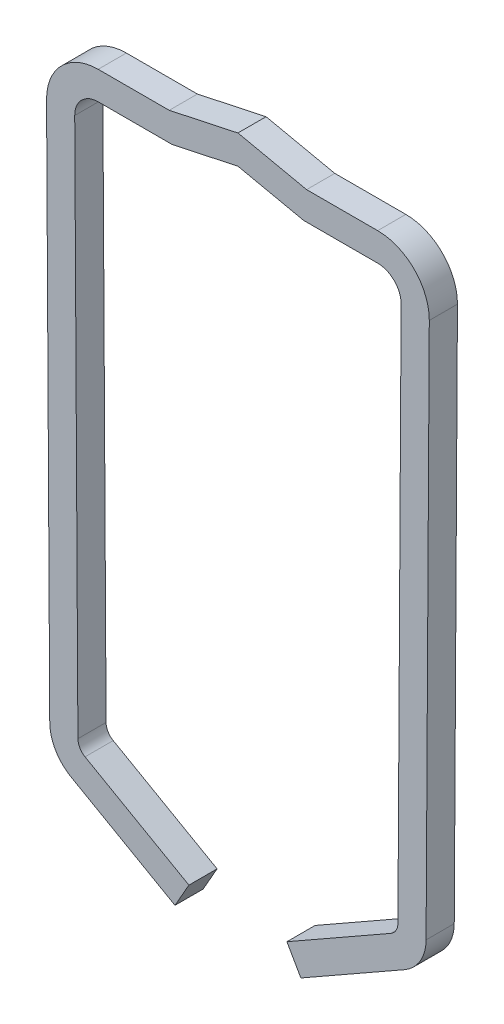
ISO-10303-21;
HEADER;
FILE_DESCRIPTION(('STEP AP214'),'2;1');
FILE_NAME('part.step','',(''),(''),'','','');
FILE_SCHEMA(('AUTOMOTIVE_DESIGN { 1 0 10303 214 1 1 1 1 }'));
ENDSEC;
DATA;
#1=APPLICATION_CONTEXT('core data for automotive mechanical design processes');
#2=APPLICATION_PROTOCOL_DEFINITION('international standard','automotive_design',2000,#1);
#3=PRODUCT_CONTEXT('',#1,'mechanical');
#4=PRODUCT('Part','Part','',(#3));
#5=PRODUCT_RELATED_PRODUCT_CATEGORY('part','',(#4));
#6=PRODUCT_DEFINITION_FORMATION('','',#4);
#7=PRODUCT_DEFINITION_CONTEXT('part definition',#1,'design');
#8=PRODUCT_DEFINITION('design','',#6,#7);
#9=PRODUCT_DEFINITION_SHAPE('','',#8);
#10=(LENGTH_UNIT() NAMED_UNIT(*) SI_UNIT(.MILLI.,.METRE.));
#11=(NAMED_UNIT(*) PLANE_ANGLE_UNIT() SI_UNIT($,.RADIAN.));
#12=(NAMED_UNIT(*) SI_UNIT($,.STERADIAN.) SOLID_ANGLE_UNIT());
#13=UNCERTAINTY_MEASURE_WITH_UNIT(LENGTH_MEASURE(1.E-05),#10,'distance_accuracy_value','');
#14=(GEOMETRIC_REPRESENTATION_CONTEXT(3) GLOBAL_UNCERTAINTY_ASSIGNED_CONTEXT((#13)) GLOBAL_UNIT_ASSIGNED_CONTEXT((#10,
#11,#12)) REPRESENTATION_CONTEXT('',''));
#15=CARTESIAN_POINT('',(0.,0.,0.));
#16=DIRECTION('',(0.,0.,1.));
#17=DIRECTION('',(1.,0.,0.));
#18=AXIS2_PLACEMENT_3D('',#15,#16,#17);
#19=CARTESIAN_POINT('',(-15.580990054256,9.75233172291069,29.2718890659961));
#20=DIRECTION('',(0.,0.,-1.));
#21=DIRECTION('',(0.,1.,0.));
#22=AXIS2_PLACEMENT_3D('',#19,#20,#21);
#23=CYLINDRICAL_SURFACE('',#22,0.75);
#24=DIRECTION('',(0.,0.,1.));
#25=VECTOR('',#24,1.);
#26=CARTESIAN_POINT('',(-14.831003372568,9.74786212670069,29.5218890659961));
#27=LINE('',#26,#25);
#28=CARTESIAN_POINT('',(-14.831003372568,9.74786212670384,29.5218890659961));
#29=VERTEX_POINT('',#28);
#30=CARTESIAN_POINT('',(-14.831003372568,9.74786212670386,31.0218890659961));
#31=VERTEX_POINT('',#30);
#32=EDGE_CURVE('E242',#29,#31,#27,.T.);
#33=ORIENTED_EDGE('',*,*,#32,.F.);
#34=CARTESIAN_POINT('',(-15.580990054256,9.75233172291069,29.5218890659961));
#35=DIRECTION('',(0.,0.,-1.));
#36=DIRECTION('',(0.,1.,0.));
#37=AXIS2_PLACEMENT_3D('',#34,#35,#36);
#38=CIRCLE('',#37,0.75);
#39=CARTESIAN_POINT('',(-15.2098674972687,9.10058940596284,29.5218890659961));
#40=VERTEX_POINT('',#39);
#41=EDGE_CURVE('E19',#40,#29,#38,.F.);
#42=ORIENTED_EDGE('',*,*,#41,.F.);
#43=DIRECTION('',(0.,0.,1.));
#44=VECTOR('',#43,1.);
#45=CARTESIAN_POINT('',(-15.2098674972707,9.10058940596364,29.5218890659961));
#46=LINE('',#45,#44);
#47=CARTESIAN_POINT('',(-15.2098674972693,9.1005894059644,31.0218890659961));
#48=VERTEX_POINT('',#47);
#49=EDGE_CURVE('E246',#48,#40,#46,.F.);
#50=ORIENTED_EDGE('',*,*,#49,.F.);
#51=CARTESIAN_POINT('',(-15.580990054256,9.75233172291069,31.0218890659961));
#52=DIRECTION('',(0.,0.,-1.));
#53=DIRECTION('',(0.,1.,0.));
#54=AXIS2_PLACEMENT_3D('',#51,#52,#53);
#55=CIRCLE('',#54,0.75);
#56=EDGE_CURVE('E398',#31,#48,#55,.T.);
#57=ORIENTED_EDGE('',*,*,#56,.F.);
#58=EDGE_LOOP('',(#33,#42,#50,#57));
#59=FACE_BOUND('',#58,.T.);
#60=ADVANCED_FACE('F16',(#59),#23,.F.);
#61=CARTESIAN_POINT('',(-31.124438416604,9.75233172291069,29.2718890659961));
#62=DIRECTION('',(0.,0.,-1.));
#63=DIRECTION('',(0.,1.,0.));
#64=AXIS2_PLACEMENT_3D('',#61,#62,#63);
#65=CYLINDRICAL_SURFACE('',#64,0.75);
#66=DIRECTION('',(0.,0.,1.));
#67=VECTOR('',#66,1.);
#68=CARTESIAN_POINT('',(-31.495560973591,9.1005894059607,29.5218890659961));
#69=LINE('',#68,#67);
#70=CARTESIAN_POINT('',(-31.4955609735922,9.10058940596137,29.5218890659961));
#71=VERTEX_POINT('',#70);
#72=CARTESIAN_POINT('',(-31.4955609735924,9.10058940596146,31.0218890659961));
#73=VERTEX_POINT('',#72);
#74=EDGE_CURVE('E326',#71,#73,#69,.T.);
#75=ORIENTED_EDGE('',*,*,#74,.F.);
#76=CARTESIAN_POINT('',(-31.124438416604,9.75233172291069,29.5218890659961));
#77=DIRECTION('',(0.,0.,-1.));
#78=DIRECTION('',(0.,1.,0.));
#79=AXIS2_PLACEMENT_3D('',#76,#77,#78);
#80=CIRCLE('',#79,0.75);
#81=CARTESIAN_POINT('',(-31.8744250982924,9.74786212670384,29.5218890659961));
#82=VERTEX_POINT('',#81);
#83=EDGE_CURVE('E399',#82,#71,#80,.F.);
#84=ORIENTED_EDGE('',*,*,#83,.F.);
#85=DIRECTION('',(0.,0.,1.));
#86=VECTOR('',#85,1.);
#87=CARTESIAN_POINT('',(-31.8744250982928,9.74786212670068,29.5218890659961));
#88=LINE('',#87,#86);
#89=CARTESIAN_POINT('',(-31.8744250982929,9.74786212670385,31.0218890659961));
#90=VERTEX_POINT('',#89);
#91=EDGE_CURVE('E333',#90,#82,#88,.F.);
#92=ORIENTED_EDGE('',*,*,#91,.F.);
#93=CARTESIAN_POINT('',(-31.124438416604,9.75233172291069,31.0218890659961));
#94=DIRECTION('',(0.,0.,-1.));
#95=DIRECTION('',(0.,1.,0.));
#96=AXIS2_PLACEMENT_3D('',#93,#94,#95);
#97=CIRCLE('',#96,0.75);
#98=EDGE_CURVE('E306',#73,#90,#97,.T.);
#99=ORIENTED_EDGE('',*,*,#98,.F.);
#100=EDGE_LOOP('',(#75,#84,#92,#99));
#101=FACE_BOUND('',#100,.T.);
#102=ADVANCED_FACE('F744',(#101),#65,.F.);
#103=CARTESIAN_POINT('',(-20.74271423543,5.95001259746069,31.0218890659961));
#104=DIRECTION('',(0.,0.,1.));
#105=DIRECTION('',(0.,-1.,0.));
#106=AXIS2_PLACEMENT_3D('',#103,#104,#105);
#107=PLANE('',#106);
#108=CARTESIAN_POINT('',(-30.795242578558,38.4143181664607,31.0218890659961));
#109=DIRECTION('',(0.,0.,-1.));
#110=DIRECTION('',(0.,1.,0.));
#111=AXIS2_PLACEMENT_3D('',#108,#109,#110);
#112=CIRCLE('',#111,1.25);
#113=CARTESIAN_POINT('',(-32.045220381372,38.4068688394526,31.0218890659961));
#114=VERTEX_POINT('',#113);
#115=CARTESIAN_POINT('',(-30.795242578558,39.6643181664607,31.0218890659961));
#116=VERTEX_POINT('',#115);
#117=EDGE_CURVE('E334',#114,#116,#112,.T.);
#118=ORIENTED_EDGE('',*,*,#117,.T.);
#119=DIRECTION('',(1.,0.,0.));
#120=VECTOR('',#119,1.);
#121=CARTESIAN_POINT('',(-26.85271423543,39.6643181664607,31.0218890659961));
#122=LINE('',#121,#120);
#123=CARTESIAN_POINT('',(-26.85271423543,39.6643181664607,31.0218890659961));
#124=VERTEX_POINT('',#123);
#125=EDGE_CURVE('E335',#124,#116,#122,.F.);
#126=ORIENTED_EDGE('',*,*,#125,.F.);
#127=DIRECTION('',(0.977802414077404,0.209529088730901,0.));
#128=VECTOR('',#127,1.);
#129=CARTESIAN_POINT('',(-23.35271423543,40.4143181664607,31.0218890659961));
#130=LINE('',#129,#128);
#131=CARTESIAN_POINT('',(-23.35271423543,40.4143181664607,31.0218890659961));
#132=VERTEX_POINT('',#131);
#133=EDGE_CURVE('E204',#132,#124,#130,.F.);
#134=ORIENTED_EDGE('',*,*,#133,.F.);
#135=DIRECTION('',(0.977802414077404,-0.209529088730901,0.));
#136=VECTOR('',#135,1.);
#137=CARTESIAN_POINT('',(-19.85271423543,39.6643181664607,31.0218890659961));
#138=LINE('',#137,#136);
#139=CARTESIAN_POINT('',(-19.85271423543,39.6643181664607,31.0218890659961));
#140=VERTEX_POINT('',#139);
#141=EDGE_CURVE('E206',#140,#132,#138,.F.);
#142=ORIENTED_EDGE('',*,*,#141,.F.);
#143=DIRECTION('',(1.,0.,0.));
#144=VECTOR('',#143,1.);
#145=CARTESIAN_POINT('',(-15.910185892302,39.6643181664607,31.0218890659961));
#146=LINE('',#145,#144);
#147=CARTESIAN_POINT('',(-15.910185892302,39.6643181664607,31.0218890659961));
#148=VERTEX_POINT('',#147);
#149=EDGE_CURVE('E211',#148,#140,#146,.F.);
#150=ORIENTED_EDGE('',*,*,#149,.F.);
#151=CARTESIAN_POINT('',(-15.910185892302,38.4143181664607,31.0218890659961));
#152=DIRECTION('',(0.,0.,-1.));
#153=DIRECTION('',(0.,1.,0.));
#154=AXIS2_PLACEMENT_3D('',#151,#152,#153);
#155=CIRCLE('',#154,1.25);
#156=CARTESIAN_POINT('',(-14.6602080894885,38.4068688394526,31.0218890659961));
#157=VERTEX_POINT('',#156);
#158=EDGE_CURVE('E224',#148,#157,#155,.T.);
#159=ORIENTED_EDGE('',*,*,#158,.T.);
#160=DIRECTION('',(-0.00595946160490619,-0.999982242251021,0.));
#161=VECTOR('',#160,1.);
#162=CARTESIAN_POINT('',(-14.831003372568,9.74786212670069,31.0218890659961));
#163=LINE('',#162,#161);
#164=EDGE_CURVE('E245',#31,#157,#163,.F.);
#165=ORIENTED_EDGE('',*,*,#164,.F.);
#166=ORIENTED_EDGE('',*,*,#56,.T.);
#167=DIRECTION('',(-0.868989755925164,-0.49483007598278,0.));
#168=VECTOR('',#167,1.);
#169=CARTESIAN_POINT('',(-20.74271423543,5.95001259746069,31.0218890659961));
#170=LINE('',#169,#168);
#171=CARTESIAN_POINT('',(-20.74271423543,5.95001259746069,31.0218890659961));
#172=VERTEX_POINT('',#171);
#173=EDGE_CURVE('E248',#172,#48,#170,.F.);
#174=ORIENTED_EDGE('',*,*,#173,.F.);
#175=DIRECTION('',(-0.49483007598278,0.868989755925164,0.));
#176=VECTOR('',#175,1.);
#177=CARTESIAN_POINT('',(-20.74271423543,5.95001259746069,31.0218890659961));
#178=LINE('',#177,#176);
#179=CARTESIAN_POINT('',(-20.0004691214549,4.64652796357132,31.0218890659961));
#180=VERTEX_POINT('',#179);
#181=EDGE_CURVE('E261',#172,#180,#178,.F.);
#182=ORIENTED_EDGE('',*,*,#181,.T.);
#183=DIRECTION('',(0.868989755925164,0.49483007598278,0.));
#184=VECTOR('',#183,1.);
#185=CARTESIAN_POINT('',(-20.000469121456,4.64652796357069,31.0218890659961));
#186=LINE('',#185,#184);
#187=CARTESIAN_POINT('',(-14.4676223832948,7.79710477207472,31.0218890659961));
#188=VERTEX_POINT('',#187);
#189=EDGE_CURVE('E267',#188,#180,#186,.F.);
#190=ORIENTED_EDGE('',*,*,#189,.F.);
#191=CARTESIAN_POINT('',(-15.580990054256,9.75233172291069,31.0218890659961));
#192=DIRECTION('',(0.,0.,-1.));
#193=DIRECTION('',(0.,1.,0.));
#194=AXIS2_PLACEMENT_3D('',#191,#192,#193);
#195=CIRCLE('',#194,2.25);
#196=CARTESIAN_POINT('',(-13.3310300091906,9.73892293430017,31.0218890659961));
#197=VERTEX_POINT('',#196);
#198=EDGE_CURVE('E268',#197,#188,#195,.T.);
#199=ORIENTED_EDGE('',*,*,#198,.F.);
#200=DIRECTION('',(0.00595946160490619,0.999982242251021,0.));
#201=VECTOR('',#200,1.);
#202=CARTESIAN_POINT('',(-13.33103000919,9.73892293430069,31.0218890659961));
#203=LINE('',#202,#201);
#204=CARTESIAN_POINT('',(-13.1602347261109,38.397929647049,31.0218890659961));
#205=VERTEX_POINT('',#204);
#206=EDGE_CURVE('E272',#205,#197,#203,.F.);
#207=ORIENTED_EDGE('',*,*,#206,.F.);
#208=CARTESIAN_POINT('',(-15.910185892302,38.4143181664607,31.0218890659961));
#209=DIRECTION('',(0.,0.,-1.));
#210=DIRECTION('',(0.,1.,0.));
#211=AXIS2_PLACEMENT_3D('',#208,#209,#210);
#212=CIRCLE('',#211,2.75);
#213=CARTESIAN_POINT('',(-15.910185892302,41.1643181664607,31.0218890659961));
#214=VERTEX_POINT('',#213);
#215=EDGE_CURVE('E276',#214,#205,#212,.T.);
#216=ORIENTED_EDGE('',*,*,#215,.F.);
#217=DIRECTION('',(1.,0.,0.));
#218=VECTOR('',#217,1.);
#219=CARTESIAN_POINT('',(-15.910185892302,41.1643181664607,31.0218890659961));
#220=LINE('',#219,#218);
#221=CARTESIAN_POINT('',(-19.6938037037917,41.1643181664619,31.0218890659961));
#222=VERTEX_POINT('',#221);
#223=EDGE_CURVE('E280',#222,#214,#220,.T.);
#224=ORIENTED_EDGE('',*,*,#223,.F.);
#225=DIRECTION('',(-0.977802414077404,0.209529088730901,0.));
#226=VECTOR('',#225,1.);
#227=CARTESIAN_POINT('',(-19.538420602334,41.1310217875807,31.0218890659961));
#228=LINE('',#227,#226);
#229=CARTESIAN_POINT('',(-23.3527142354298,41.9483704232441,31.0218890659961));
#230=VERTEX_POINT('',#229);
#231=EDGE_CURVE('E284',#230,#222,#228,.F.);
#232=ORIENTED_EDGE('',*,*,#231,.F.);
#233=DIRECTION('',(-0.977802414077404,-0.209529088730901,0.));
#234=VECTOR('',#233,1.);
#235=CARTESIAN_POINT('',(-23.6670078685263,41.8810217875807,31.0218890659961));
#236=LINE('',#235,#234);
#237=CARTESIAN_POINT('',(-27.0116247670683,41.1643181664619,31.0218890659961));
#238=VERTEX_POINT('',#237);
#239=EDGE_CURVE('E175',#238,#230,#236,.F.);
#240=ORIENTED_EDGE('',*,*,#239,.F.);
#241=DIRECTION('',(1.,0.,0.));
#242=VECTOR('',#241,1.);
#243=CARTESIAN_POINT('',(-26.85271423543,41.1643181664607,31.0218890659961));
#244=LINE('',#243,#242);
#245=CARTESIAN_POINT('',(-30.795242578558,41.1643181664607,31.0218890659961));
#246=VERTEX_POINT('',#245);
#247=EDGE_CURVE('E298',#246,#238,#244,.T.);
#248=ORIENTED_EDGE('',*,*,#247,.F.);
#249=CARTESIAN_POINT('',(-30.795242578558,38.4143181664607,31.0218890659961));
#250=DIRECTION('',(0.,0.,-1.));
#251=DIRECTION('',(0.,1.,0.));
#252=AXIS2_PLACEMENT_3D('',#249,#250,#251);
#253=CIRCLE('',#252,2.75);
#254=CARTESIAN_POINT('',(-33.5451937447491,38.397929647049,31.0218890659961));
#255=VERTEX_POINT('',#254);
#256=EDGE_CURVE('E302',#255,#246,#253,.T.);
#257=ORIENTED_EDGE('',*,*,#256,.F.);
#258=DIRECTION('',(0.00595946160490607,-0.999982242251021,0.));
#259=VECTOR('',#258,1.);
#260=CARTESIAN_POINT('',(-33.54519374475,38.3979296470507,31.0218890659961));
#261=LINE('',#260,#259);
#262=CARTESIAN_POINT('',(-33.3743984616709,9.73892293430017,31.0218890659961));
#263=VERTEX_POINT('',#262);
#264=EDGE_CURVE('E309',#263,#255,#261,.F.);
#265=ORIENTED_EDGE('',*,*,#264,.F.);
#266=CARTESIAN_POINT('',(-31.124438416604,9.75233172291069,31.0218890659961));
#267=DIRECTION('',(0.,0.,-1.));
#268=DIRECTION('',(0.,1.,0.));
#269=AXIS2_PLACEMENT_3D('',#266,#267,#268);
#270=CIRCLE('',#269,2.25);
#271=CARTESIAN_POINT('',(-32.2378060875651,7.79710477207488,31.0218890659961));
#272=VERTEX_POINT('',#271);
#273=EDGE_CURVE('E391',#272,#263,#270,.T.);
#274=ORIENTED_EDGE('',*,*,#273,.F.);
#275=DIRECTION('',(0.868989755925164,-0.49483007598278,0.));
#276=VECTOR('',#275,1.);
#277=CARTESIAN_POINT('',(-32.237806087565,7.79710477207069,31.0218890659961));
#278=LINE('',#277,#276);
#279=CARTESIAN_POINT('',(-26.7049593494055,4.64652796356894,31.0218890659961));
#280=VERTEX_POINT('',#279);
#281=EDGE_CURVE('E313',#280,#272,#278,.F.);
#282=ORIENTED_EDGE('',*,*,#281,.F.);
#283=DIRECTION('',(0.49483007598278,0.868989755925164,0.));
#284=VECTOR('',#283,1.);
#285=CARTESIAN_POINT('',(-25.96271423543,5.95001259746069,31.0218890659961));
#286=LINE('',#285,#284);
#287=CARTESIAN_POINT('',(-25.9627142354306,5.95001259745971,31.0218890659961));
#288=VERTEX_POINT('',#287);
#289=EDGE_CURVE('E319',#288,#280,#286,.F.);
#290=ORIENTED_EDGE('',*,*,#289,.F.);
#291=DIRECTION('',(-0.868989755925164,0.49483007598278,0.));
#292=VECTOR('',#291,1.);
#293=CARTESIAN_POINT('',(-31.495560973591,9.1005894059607,31.0218890659961));
#294=LINE('',#293,#292);
#295=EDGE_CURVE('E324',#73,#288,#294,.F.);
#296=ORIENTED_EDGE('',*,*,#295,.F.);
#297=ORIENTED_EDGE('',*,*,#98,.T.);
#298=DIRECTION('',(-0.00595946160490607,0.999982242251021,0.));
#299=VECTOR('',#298,1.);
#300=CARTESIAN_POINT('',(-32.045220381372,38.4068688394507,31.0218890659961));
#301=LINE('',#300,#299);
#302=EDGE_CURVE('E330',#114,#90,#301,.F.);
#303=ORIENTED_EDGE('',*,*,#302,.F.);
#304=EDGE_LOOP('',(#118,#126,#134,#142,#150,#159,#165,#166,#174,#182,#190,#199,#207,#216,#224,
#232,#240,#248,#257,#265,#274,#282,#290,#296,#297,#303));
#305=FACE_BOUND('',#304,.T.);
#306=ADVANCED_FACE('F209',(#305),#107,.T.);
#307=CARTESIAN_POINT('',(-23.6670078685263,41.8810217875807,31.0218890659961));
#308=DIRECTION('',(-0.209529088730901,0.977802414077404,0.));
#309=DIRECTION('',(-0.977802414077404,-0.209529088730901,0.));
#310=AXIS2_PLACEMENT_3D('',#307,#308,#309);
#311=PLANE('',#310);
#312=ORIENTED_EDGE('',*,*,#239,.T.);
#313=DIRECTION('',(0.,0.,1.));
#314=VECTOR('',#313,1.);
#315=CARTESIAN_POINT('',(-23.3527142354293,41.9483704232441,31.0218890659961));
#316=LINE('',#315,#314);
#317=CARTESIAN_POINT('',(-23.3527142354298,41.9483704232418,29.5218890659961));
#318=VERTEX_POINT('',#317);
#319=EDGE_CURVE('E293',#318,#230,#316,.T.);
#320=ORIENTED_EDGE('',*,*,#319,.F.);
#321=DIRECTION('',(0.977802414077386,0.209529088730983,0.));
#322=VECTOR('',#321,1.);
#323=CARTESIAN_POINT('',(-27.011624767068,41.1643181664607,29.5218890659961));
#324=LINE('',#323,#322);
#325=CARTESIAN_POINT('',(-27.011624767068,41.1643181664607,29.5218890659961));
#326=VERTEX_POINT('',#325);
#327=EDGE_CURVE('E181',#326,#318,#324,.T.);
#328=ORIENTED_EDGE('',*,*,#327,.F.);
#329=DIRECTION('',(0.,0.,1.));
#330=VECTOR('',#329,1.);
#331=CARTESIAN_POINT('',(-27.011624767068,41.1643181664607,31.0218890659961));
#332=LINE('',#331,#330);
#333=EDGE_CURVE('E301',#238,#326,#332,.F.);
#334=ORIENTED_EDGE('',*,*,#333,.F.);
#335=EDGE_LOOP('',(#312,#320,#328,#334));
#336=FACE_BOUND('',#335,.T.);
#337=ADVANCED_FACE('F726',(#336),#311,.T.);
#338=CARTESIAN_POINT('',(-19.538420602334,41.1310217875807,31.0218890659961));
#339=DIRECTION('',(0.209529088730901,0.977802414077404,0.));
#340=DIRECTION('',(-0.977802414077404,0.209529088730901,0.));
#341=AXIS2_PLACEMENT_3D('',#338,#339,#340);
#342=PLANE('',#341);
#343=ORIENTED_EDGE('',*,*,#231,.T.);
#344=DIRECTION('',(0.,0.,1.));
#345=VECTOR('',#344,1.);
#346=CARTESIAN_POINT('',(-19.693803703792,41.1643181664607,31.0218890659961));
#347=LINE('',#346,#345);
#348=CARTESIAN_POINT('',(-19.693803703792,41.1643181664607,29.5218890659961));
#349=VERTEX_POINT('',#348);
#350=EDGE_CURVE('E281',#349,#222,#347,.T.);
#351=ORIENTED_EDGE('',*,*,#350,.F.);
#352=DIRECTION('',(0.977802414077386,-0.209529088730983,0.));
#353=VECTOR('',#352,1.);
#354=CARTESIAN_POINT('',(-23.35271423543,41.9483704232407,29.5218890659961));
#355=LINE('',#354,#353);
#356=EDGE_CURVE('E287',#318,#349,#355,.T.);
#357=ORIENTED_EDGE('',*,*,#356,.F.);
#358=ORIENTED_EDGE('',*,*,#319,.T.);
#359=EDGE_LOOP('',(#343,#351,#357,#358));
#360=FACE_BOUND('',#359,.T.);
#361=ADVANCED_FACE('F716',(#360),#342,.T.);
#362=CARTESIAN_POINT('',(-15.910185892302,41.1643181664607,31.0218890659961));
#363=DIRECTION('',(0.,1.,0.));
#364=DIRECTION('',(0.,0.,1.));
#365=AXIS2_PLACEMENT_3D('',#362,#363,#364);
#366=PLANE('',#365);
#367=ORIENTED_EDGE('',*,*,#223,.T.);
#368=DIRECTION('',(0.,0.,-1.));
#369=VECTOR('',#368,1.);
#370=CARTESIAN_POINT('',(-15.910185892302,41.1643181664607,29.2718890659961));
#371=LINE('',#370,#369);
#372=CARTESIAN_POINT('',(-15.910185892302,41.1643181664607,29.5218890659961));
#373=VERTEX_POINT('',#372);
#374=EDGE_CURVE('E277',#373,#214,#371,.F.);
#375=ORIENTED_EDGE('',*,*,#374,.F.);
#376=DIRECTION('',(1.,0.,0.));
#377=VECTOR('',#376,1.);
#378=CARTESIAN_POINT('',(-20.000469121456,41.1643181664607,29.5218890659961));
#379=LINE('',#378,#377);
#380=EDGE_CURVE('E290',#349,#373,#379,.T.);
#381=ORIENTED_EDGE('',*,*,#380,.F.);
#382=ORIENTED_EDGE('',*,*,#350,.T.);
#383=EDGE_LOOP('',(#367,#375,#381,#382));
#384=FACE_BOUND('',#383,.T.);
#385=ADVANCED_FACE('F706',(#384),#366,.T.);
#386=CARTESIAN_POINT('',(-15.910185892302,38.4143181664607,29.2718890659961));
#387=DIRECTION('',(0.,0.,-1.));
#388=DIRECTION('',(0.,1.,0.));
#389=AXIS2_PLACEMENT_3D('',#386,#387,#388);
#390=CYLINDRICAL_SURFACE('',#389,2.75);
#391=ORIENTED_EDGE('',*,*,#215,.T.);
#392=DIRECTION('',(0.,0.,1.));
#393=VECTOR('',#392,1.);
#394=CARTESIAN_POINT('',(-13.1602347261109,38.3979296470507,31.0218890659961));
#395=LINE('',#394,#393);
#396=CARTESIAN_POINT('',(-13.1602347261104,38.3979296470489,29.5218890659961));
#397=VERTEX_POINT('',#396);
#398=EDGE_CURVE('E273',#397,#205,#395,.T.);
#399=ORIENTED_EDGE('',*,*,#398,.F.);
#400=CARTESIAN_POINT('',(-15.910185892302,38.4143181664607,29.5218890659961));
#401=DIRECTION('',(0.,0.,-1.));
#402=DIRECTION('',(0.,1.,0.));
#403=AXIS2_PLACEMENT_3D('',#400,#401,#402);
#404=CIRCLE('',#403,2.75);
#405=EDGE_CURVE('E387',#373,#397,#404,.T.);
#406=ORIENTED_EDGE('',*,*,#405,.F.);
#407=ORIENTED_EDGE('',*,*,#374,.T.);
#408=EDGE_LOOP('',(#391,#399,#406,#407));
#409=FACE_BOUND('',#408,.T.);
#410=ADVANCED_FACE('F696',(#409),#390,.T.);
#411=CARTESIAN_POINT('',(-13.33103000919,9.73892293430069,31.0218890659961));
#412=DIRECTION('',(0.999982242251021,-0.00595946160490619,0.));
#413=DIRECTION('',(0.00595946160490619,0.999982242251021,0.));
#414=AXIS2_PLACEMENT_3D('',#411,#412,#413);
#415=PLANE('',#414);
#416=ORIENTED_EDGE('',*,*,#206,.T.);
#417=DIRECTION('',(0.,0.,-1.));
#418=VECTOR('',#417,1.);
#419=CARTESIAN_POINT('',(-13.3310300091912,9.7389229343007,29.2718890659961));
#420=LINE('',#419,#418);
#421=CARTESIAN_POINT('',(-13.3310300091906,9.73892293430014,29.5218890659961));
#422=VERTEX_POINT('',#421);
#423=EDGE_CURVE('E269',#422,#197,#420,.F.);
#424=ORIENTED_EDGE('',*,*,#423,.F.);
#425=DIRECTION('',(-0.00595946160493604,-0.999982242251021,0.));
#426=VECTOR('',#425,1.);
#427=CARTESIAN_POINT('',(-13.16023472611,38.3979296470507,29.5218890659961));
#428=LINE('',#427,#426);
#429=EDGE_CURVE('E386',#397,#422,#428,.T.);
#430=ORIENTED_EDGE('',*,*,#429,.F.);
#431=ORIENTED_EDGE('',*,*,#398,.T.);
#432=EDGE_LOOP('',(#416,#424,#430,#431));
#433=FACE_BOUND('',#432,.T.);
#434=ADVANCED_FACE('F686',(#433),#415,.T.);
#435=CARTESIAN_POINT('',(-15.580990054256,9.75233172291069,29.2718890659961));
#436=DIRECTION('',(0.,0.,-1.));
#437=DIRECTION('',(0.,1.,0.));
#438=AXIS2_PLACEMENT_3D('',#435,#436,#437);
#439=CYLINDRICAL_SURFACE('',#438,2.25);
#440=ORIENTED_EDGE('',*,*,#198,.T.);
#441=DIRECTION('',(0.,0.,1.));
#442=VECTOR('',#441,1.);
#443=CARTESIAN_POINT('',(-14.4676223832967,7.79710477207364,31.0218890659961));
#444=LINE('',#443,#442);
#445=CARTESIAN_POINT('',(-14.4676223832945,7.79710477207295,29.5218890659961));
#446=VERTEX_POINT('',#445);
#447=EDGE_CURVE('E264',#446,#188,#444,.T.);
#448=ORIENTED_EDGE('',*,*,#447,.F.);
#449=CARTESIAN_POINT('',(-15.580990054256,9.75233172291069,29.5218890659961));
#450=DIRECTION('',(0.,0.,-1.));
#451=DIRECTION('',(0.,1.,0.));
#452=AXIS2_PLACEMENT_3D('',#449,#450,#451);
#453=CIRCLE('',#452,2.25);
#454=EDGE_CURVE('E383',#422,#446,#453,.T.);
#455=ORIENTED_EDGE('',*,*,#454,.F.);
#456=ORIENTED_EDGE('',*,*,#423,.T.);
#457=EDGE_LOOP('',(#440,#448,#455,#456));
#458=FACE_BOUND('',#457,.T.);
#459=ADVANCED_FACE('F676',(#458),#439,.T.);
#460=CARTESIAN_POINT('',(-20.000469121456,4.64652796357069,31.0218890659961));
#461=DIRECTION('',(0.49483007598278,-0.868989755925164,0.));
#462=DIRECTION('',(0.868989755925164,0.49483007598278,0.));
#463=AXIS2_PLACEMENT_3D('',#460,#461,#462);
#464=PLANE('',#463);
#465=ORIENTED_EDGE('',*,*,#189,.T.);
#466=DIRECTION('',(0.,0.,1.));
#467=VECTOR('',#466,1.);
#468=CARTESIAN_POINT('',(-20.0004691214549,4.64652796357132,30.2718890659961));
#469=LINE('',#468,#467);
#470=CARTESIAN_POINT('',(-20.0004691214556,4.6465279635709,29.5218890659961));
#471=VERTEX_POINT('',#470);
#472=EDGE_CURVE('E259',#180,#471,#469,.F.);
#473=ORIENTED_EDGE('',*,*,#472,.T.);
#474=DIRECTION('',(-0.868989755925427,-0.494830075982318,0.));
#475=VECTOR('',#474,1.);
#476=CARTESIAN_POINT('',(-14.467622383295,7.79710477207069,29.5218890659961));
#477=LINE('',#476,#475);
#478=EDGE_CURVE('E256',#446,#471,#477,.T.);
#479=ORIENTED_EDGE('',*,*,#478,.F.);
#480=ORIENTED_EDGE('',*,*,#447,.T.);
#481=EDGE_LOOP('',(#465,#473,#479,#480));
#482=FACE_BOUND('',#481,.T.);
#483=ADVANCED_FACE('F667',(#482),#464,.T.);
#484=CARTESIAN_POINT('',(-20.74271423543,5.95001259746069,30.2718890659961));
#485=DIRECTION('',(0.868989755925164,0.49483007598278,0.));
#486=DIRECTION('',(-0.49483007598278,0.868989755925164,0.));
#487=AXIS2_PLACEMENT_3D('',#484,#485,#486);
#488=PLANE('',#487);
#489=ORIENTED_EDGE('',*,*,#472,.F.);
#490=ORIENTED_EDGE('',*,*,#181,.F.);
#491=DIRECTION('',(0.,0.,1.));
#492=VECTOR('',#491,1.);
#493=CARTESIAN_POINT('',(-20.74271423543,5.95001259746069,29.5218890659961));
#494=LINE('',#493,#492);
#495=CARTESIAN_POINT('',(-20.74271423543,5.95001259746069,29.5218890659961));
#496=VERTEX_POINT('',#495);
#497=EDGE_CURVE('E151',#496,#172,#494,.T.);
#498=ORIENTED_EDGE('',*,*,#497,.F.);
#499=DIRECTION('',(-0.494830075982048,0.868989755925581,0.));
#500=VECTOR('',#499,1.);
#501=CARTESIAN_POINT('',(-20.000469121456,4.64652796357069,29.5218890659961));
#502=LINE('',#501,#500);
#503=EDGE_CURVE('E252',#471,#496,#502,.T.);
#504=ORIENTED_EDGE('',*,*,#503,.F.);
#505=EDGE_LOOP('',(#489,#490,#498,#504));
#506=FACE_BOUND('',#505,.T.);
#507=ADVANCED_FACE('F657',(#506),#488,.F.);
#508=CARTESIAN_POINT('',(-20.74271423543,5.95001259746069,29.5218890659961));
#509=DIRECTION('',(-0.49483007598278,0.868989755925164,0.));
#510=DIRECTION('',(-0.868989755925164,-0.49483007598278,0.));
#511=AXIS2_PLACEMENT_3D('',#508,#509,#510);
#512=PLANE('',#511);
#513=DIRECTION('',(0.868989755925427,0.494830075982318,0.));
#514=VECTOR('',#513,1.);
#515=CARTESIAN_POINT('',(-20.74271423543,5.95001259746069,29.5218890659961));
#516=LINE('',#515,#514);
#517=EDGE_CURVE('E255',#496,#40,#516,.T.);
#518=ORIENTED_EDGE('',*,*,#517,.F.);
#519=ORIENTED_EDGE('',*,*,#497,.T.);
#520=ORIENTED_EDGE('',*,*,#173,.T.);
#521=ORIENTED_EDGE('',*,*,#49,.T.);
#522=EDGE_LOOP('',(#518,#519,#520,#521));
#523=FACE_BOUND('',#522,.T.);
#524=ADVANCED_FACE('F648',(#523),#512,.T.);
#525=CARTESIAN_POINT('',(-14.831003372568,9.74786212670069,29.5218890659961));
#526=DIRECTION('',(-0.999982242251021,0.00595946160490619,0.));
#527=DIRECTION('',(-0.00595946160490619,-0.999982242251021,0.));
#528=AXIS2_PLACEMENT_3D('',#525,#526,#527);
#529=PLANE('',#528);
#530=DIRECTION('',(0.0059594616049361,0.999982242251021,0.));
#531=VECTOR('',#530,1.);
#532=CARTESIAN_POINT('',(-14.831003372568,9.74786212670069,29.5218890659961));
#533=LINE('',#532,#531);
#534=CARTESIAN_POINT('',(-14.6602080894881,38.4068688394526,29.5218890659961));
#535=VERTEX_POINT('',#534);
#536=EDGE_CURVE('E382',#29,#535,#533,.T.);
#537=ORIENTED_EDGE('',*,*,#536,.F.);
#538=ORIENTED_EDGE('',*,*,#32,.T.);
#539=ORIENTED_EDGE('',*,*,#164,.T.);
#540=DIRECTION('',(0.,0.,-1.));
#541=VECTOR('',#540,1.);
#542=CARTESIAN_POINT('',(-14.6602080894882,38.4068688394507,29.2718890659961));
#543=LINE('',#542,#541);
#544=EDGE_CURVE('E240',#157,#535,#543,.T.);
#545=ORIENTED_EDGE('',*,*,#544,.T.);
#546=EDGE_LOOP('',(#537,#538,#539,#545));
#547=FACE_BOUND('',#546,.T.);
#548=ADVANCED_FACE('F410',(#547),#529,.T.);
#549=CARTESIAN_POINT('',(-15.910185892302,38.4143181664607,29.2718890659961));
#550=DIRECTION('',(0.,0.,-1.));
#551=DIRECTION('',(0.,1.,0.));
#552=AXIS2_PLACEMENT_3D('',#549,#550,#551);
#553=CYLINDRICAL_SURFACE('',#552,1.25);
#554=DIRECTION('',(0.,0.,-1.));
#555=VECTOR('',#554,1.);
#556=CARTESIAN_POINT('',(-15.910185892302,39.6643181664607,29.5218890659961));
#557=LINE('',#556,#555);
#558=CARTESIAN_POINT('',(-15.910185892302,39.6643181664607,29.5218890659961));
#559=VERTEX_POINT('',#558);
#560=EDGE_CURVE('E217',#559,#148,#557,.F.);
#561=ORIENTED_EDGE('',*,*,#560,.F.);
#562=CARTESIAN_POINT('',(-15.910185892302,38.4143181664607,29.5218890659961));
#563=DIRECTION('',(0.,0.,-1.));
#564=DIRECTION('',(0.,1.,0.));
#565=AXIS2_PLACEMENT_3D('',#562,#563,#564);
#566=CIRCLE('',#565,1.25);
#567=EDGE_CURVE('E378',#535,#559,#566,.F.);
#568=ORIENTED_EDGE('',*,*,#567,.F.);
#569=ORIENTED_EDGE('',*,*,#544,.F.);
#570=ORIENTED_EDGE('',*,*,#158,.F.);
#571=EDGE_LOOP('',(#561,#568,#569,#570));
#572=FACE_BOUND('',#571,.T.);
#573=ADVANCED_FACE('F630',(#572),#553,.F.);
#574=CARTESIAN_POINT('',(-15.910185892302,39.6643181664607,29.5218890659961));
#575=DIRECTION('',(0.,-1.,0.));
#576=DIRECTION('',(0.,0.,-1.));
#577=AXIS2_PLACEMENT_3D('',#574,#575,#576);
#578=PLANE('',#577);
#579=DIRECTION('',(1.,0.,0.));
#580=VECTOR('',#579,1.);
#581=CARTESIAN_POINT('',(-20.000469121456,39.6643181664607,29.5218890659961));
#582=LINE('',#581,#580);
#583=CARTESIAN_POINT('',(-19.85271423543,39.6643181664607,29.5218890659961));
#584=VERTEX_POINT('',#583);
#585=EDGE_CURVE('E381',#559,#584,#582,.F.);
#586=ORIENTED_EDGE('',*,*,#585,.F.);
#587=ORIENTED_EDGE('',*,*,#560,.T.);
#588=ORIENTED_EDGE('',*,*,#149,.T.);
#589=DIRECTION('',(0.,0.,1.));
#590=VECTOR('',#589,1.);
#591=CARTESIAN_POINT('',(-19.85271423543,39.6643181664607,29.5218890659961));
#592=LINE('',#591,#590);
#593=EDGE_CURVE('E216',#584,#140,#592,.T.);
#594=ORIENTED_EDGE('',*,*,#593,.F.);
#595=EDGE_LOOP('',(#586,#587,#588,#594));
#596=FACE_BOUND('',#595,.T.);
#597=ADVANCED_FACE('F222',(#596),#578,.T.);
#598=CARTESIAN_POINT('',(-19.85271423543,39.6643181664607,29.5218890659961));
#599=DIRECTION('',(-0.209529088730901,-0.977802414077404,0.));
#600=DIRECTION('',(0.977802414077404,-0.209529088730901,0.));
#601=AXIS2_PLACEMENT_3D('',#598,#599,#600);
#602=PLANE('',#601);
#603=DIRECTION('',(-0.977802414077409,0.209529088730874,0.));
#604=VECTOR('',#603,1.);
#605=CARTESIAN_POINT('',(-19.85271423543,39.6643181664607,29.5218890659961));
#606=LINE('',#605,#604);
#607=CARTESIAN_POINT('',(-23.35271423543,40.4143181664607,29.5218890659961));
#608=VERTEX_POINT('',#607);
#609=EDGE_CURVE('E228',#584,#608,#606,.T.);
#610=ORIENTED_EDGE('',*,*,#609,.F.);
#611=ORIENTED_EDGE('',*,*,#593,.T.);
#612=ORIENTED_EDGE('',*,*,#141,.T.);
#613=DIRECTION('',(0.,0.,1.));
#614=VECTOR('',#613,1.);
#615=CARTESIAN_POINT('',(-23.35271423543,40.4143181664607,29.5218890659961));
#616=LINE('',#615,#614);
#617=EDGE_CURVE('E231',#608,#132,#616,.T.);
#618=ORIENTED_EDGE('',*,*,#617,.F.);
#619=EDGE_LOOP('',(#610,#611,#612,#618));
#620=FACE_BOUND('',#619,.T.);
#621=ADVANCED_FACE('F226',(#620),#602,.T.);
#622=CARTESIAN_POINT('',(-23.35271423543,40.4143181664607,29.5218890659961));
#623=DIRECTION('',(0.209529088730901,-0.977802414077404,0.));
#624=DIRECTION('',(0.977802414077404,0.209529088730901,0.));
#625=AXIS2_PLACEMENT_3D('',#622,#623,#624);
#626=PLANE('',#625);
#627=DIRECTION('',(-0.97780241407741,-0.209529088730873,0.));
#628=VECTOR('',#627,1.);
#629=CARTESIAN_POINT('',(-23.35271423543,40.4143181664607,29.5218890659961));
#630=LINE('',#629,#628);
#631=CARTESIAN_POINT('',(-26.85271423543,39.6643181664607,29.5218890659961));
#632=VERTEX_POINT('',#631);
#633=EDGE_CURVE('E469',#608,#632,#630,.T.);
#634=ORIENTED_EDGE('',*,*,#633,.F.);
#635=ORIENTED_EDGE('',*,*,#617,.T.);
#636=ORIENTED_EDGE('',*,*,#133,.T.);
#637=DIRECTION('',(0.,0.,-1.));
#638=VECTOR('',#637,1.);
#639=CARTESIAN_POINT('',(-26.85271423543,39.6643181664607,29.5218890659961));
#640=LINE('',#639,#638);
#641=EDGE_CURVE('E338',#632,#124,#640,.F.);
#642=ORIENTED_EDGE('',*,*,#641,.F.);
#643=EDGE_LOOP('',(#634,#635,#636,#642));
#644=FACE_BOUND('',#643,.T.);
#645=ADVANCED_FACE('F603',(#644),#626,.T.);
#646=CARTESIAN_POINT('',(-26.85271423543,39.6643181664607,29.5218890659961));
#647=DIRECTION('',(0.,-1.,0.));
#648=DIRECTION('',(0.,0.,-1.));
#649=AXIS2_PLACEMENT_3D('',#646,#647,#648);
#650=PLANE('',#649);
#651=ORIENTED_EDGE('',*,*,#125,.T.);
#652=DIRECTION('',(0.,0.,-1.));
#653=VECTOR('',#652,1.);
#654=CARTESIAN_POINT('',(-30.795242578558,39.6643181664607,29.2718890659961));
#655=LINE('',#654,#653);
#656=CARTESIAN_POINT('',(-30.795242578558,39.6643181664607,29.5218890659961));
#657=VERTEX_POINT('',#656);
#658=EDGE_CURVE('E337',#116,#657,#655,.T.);
#659=ORIENTED_EDGE('',*,*,#658,.T.);
#660=DIRECTION('',(1.,0.,0.));
#661=VECTOR('',#660,1.);
#662=CARTESIAN_POINT('',(-20.000469121456,39.6643181664607,29.5218890659961));
#663=LINE('',#662,#661);
#664=EDGE_CURVE('E377',#632,#657,#663,.F.);
#665=ORIENTED_EDGE('',*,*,#664,.F.);
#666=ORIENTED_EDGE('',*,*,#641,.T.);
#667=EDGE_LOOP('',(#651,#659,#665,#666));
#668=FACE_BOUND('',#667,.T.);
#669=ADVANCED_FACE('F593',(#668),#650,.T.);
#670=CARTESIAN_POINT('',(-30.795242578558,38.4143181664607,29.2718890659961));
#671=DIRECTION('',(0.,0.,-1.));
#672=DIRECTION('',(0.,1.,0.));
#673=AXIS2_PLACEMENT_3D('',#670,#671,#672);
#674=CYLINDRICAL_SURFACE('',#673,1.25);
#675=DIRECTION('',(0.,0.,1.));
#676=VECTOR('',#675,1.);
#677=CARTESIAN_POINT('',(-32.045220381372,38.4068688394507,29.5218890659961));
#678=LINE('',#677,#676);
#679=CARTESIAN_POINT('',(-32.045220381372,38.4068688394526,29.5218890659961));
#680=VERTEX_POINT('',#679);
#681=EDGE_CURVE('E327',#680,#114,#678,.T.);
#682=ORIENTED_EDGE('',*,*,#681,.F.);
#683=CARTESIAN_POINT('',(-30.795242578558,38.4143181664607,29.5218890659961));
#684=DIRECTION('',(0.,0.,-1.));
#685=DIRECTION('',(0.,1.,0.));
#686=AXIS2_PLACEMENT_3D('',#683,#684,#685);
#687=CIRCLE('',#686,1.25);
#688=EDGE_CURVE('E373',#657,#680,#687,.F.);
#689=ORIENTED_EDGE('',*,*,#688,.F.);
#690=ORIENTED_EDGE('',*,*,#658,.F.);
#691=ORIENTED_EDGE('',*,*,#117,.F.);
#692=EDGE_LOOP('',(#682,#689,#690,#691));
#693=FACE_BOUND('',#692,.T.);
#694=ADVANCED_FACE('F583',(#693),#674,.F.);
#695=CARTESIAN_POINT('',(-32.045220381372,38.4068688394507,29.5218890659961));
#696=DIRECTION('',(0.999982242251021,0.00595946160490607,0.));
#697=DIRECTION('',(-0.00595946160490607,0.999982242251021,0.));
#698=AXIS2_PLACEMENT_3D('',#695,#696,#697);
#699=PLANE('',#698);
#700=DIRECTION('',(0.00595946160493568,-0.999982242251021,0.));
#701=VECTOR('',#700,1.);
#702=CARTESIAN_POINT('',(-32.045220381372,38.4068688394507,29.5218890659961));
#703=LINE('',#702,#701);
#704=EDGE_CURVE('E376',#680,#82,#703,.T.);
#705=ORIENTED_EDGE('',*,*,#704,.F.);
#706=ORIENTED_EDGE('',*,*,#681,.T.);
#707=ORIENTED_EDGE('',*,*,#302,.T.);
#708=ORIENTED_EDGE('',*,*,#91,.T.);
#709=EDGE_LOOP('',(#705,#706,#707,#708));
#710=FACE_BOUND('',#709,.T.);
#711=ADVANCED_FACE('F573',(#710),#699,.T.);
#712=CARTESIAN_POINT('',(-31.495560973591,9.1005894059607,29.5218890659961));
#713=DIRECTION('',(0.49483007598278,0.868989755925164,0.));
#714=DIRECTION('',(-0.868989755925164,0.49483007598278,0.));
#715=AXIS2_PLACEMENT_3D('',#712,#713,#714);
#716=PLANE('',#715);
#717=DIRECTION('',(0.868989755925427,-0.494830075982318,0.));
#718=VECTOR('',#717,1.);
#719=CARTESIAN_POINT('',(-31.495560973591,9.1005894059607,29.5218890659961));
#720=LINE('',#719,#718);
#721=CARTESIAN_POINT('',(-25.96271423543,5.95001259746069,29.5218890659961));
#722=VERTEX_POINT('',#721);
#723=EDGE_CURVE('E451',#71,#722,#720,.T.);
#724=ORIENTED_EDGE('',*,*,#723,.F.);
#725=ORIENTED_EDGE('',*,*,#74,.T.);
#726=ORIENTED_EDGE('',*,*,#295,.T.);
#727=DIRECTION('',(0.,0.,1.));
#728=VECTOR('',#727,1.);
#729=CARTESIAN_POINT('',(-25.96271423543,5.95001259746069,30.2718890659961));
#730=LINE('',#729,#728);
#731=EDGE_CURVE('E321',#722,#288,#730,.T.);
#732=ORIENTED_EDGE('',*,*,#731,.F.);
#733=EDGE_LOOP('',(#724,#725,#726,#732));
#734=FACE_BOUND('',#733,.T.);
#735=ADVANCED_FACE('F563',(#734),#716,.T.);
#736=CARTESIAN_POINT('',(-25.96271423543,5.95001259746069,30.2718890659961));
#737=DIRECTION('',(0.868989755925164,-0.49483007598278,0.));
#738=DIRECTION('',(0.49483007598278,0.868989755925164,0.));
#739=AXIS2_PLACEMENT_3D('',#736,#737,#738);
#740=PLANE('',#739);
#741=ORIENTED_EDGE('',*,*,#731,.T.);
#742=ORIENTED_EDGE('',*,*,#289,.T.);
#743=DIRECTION('',(0.,0.,1.));
#744=VECTOR('',#743,1.);
#745=CARTESIAN_POINT('',(-26.7049593494057,4.64652796356775,31.0218890659961));
#746=LINE('',#745,#744);
#747=CARTESIAN_POINT('',(-26.7049593494046,4.64652796356971,29.5218890659961));
#748=VERTEX_POINT('',#747);
#749=EDGE_CURVE('E316',#748,#280,#746,.T.);
#750=ORIENTED_EDGE('',*,*,#749,.F.);
#751=DIRECTION('',(-0.494830075982048,-0.868989755925581,0.));
#752=VECTOR('',#751,1.);
#753=CARTESIAN_POINT('',(-25.96271423543,5.95001259746069,29.5218890659961));
#754=LINE('',#753,#752);
#755=EDGE_CURVE('E448',#722,#748,#754,.T.);
#756=ORIENTED_EDGE('',*,*,#755,.F.);
#757=EDGE_LOOP('',(#741,#742,#750,#756));
#758=FACE_BOUND('',#757,.T.);
#759=ADVANCED_FACE('F553',(#758),#740,.T.);
#760=CARTESIAN_POINT('',(-32.237806087565,7.79710477207069,31.0218890659961));
#761=DIRECTION('',(-0.49483007598278,-0.868989755925164,0.));
#762=DIRECTION('',(0.868989755925164,-0.49483007598278,0.));
#763=AXIS2_PLACEMENT_3D('',#760,#761,#762);
#764=PLANE('',#763);
#765=ORIENTED_EDGE('',*,*,#281,.T.);
#766=DIRECTION('',(0.,0.,-1.));
#767=VECTOR('',#766,1.);
#768=CARTESIAN_POINT('',(-32.2378060875615,7.79710477207691,29.2718890659961));
#769=LINE('',#768,#767);
#770=CARTESIAN_POINT('',(-32.2378060875646,7.79710477207459,29.5218890659961));
#771=VERTEX_POINT('',#770);
#772=EDGE_CURVE('E315',#771,#272,#769,.F.);
#773=ORIENTED_EDGE('',*,*,#772,.F.);
#774=DIRECTION('',(-0.868989755925427,0.494830075982318,0.));
#775=VECTOR('',#774,1.);
#776=CARTESIAN_POINT('',(-26.704959349404,4.64652796357069,29.5218890659961));
#777=LINE('',#776,#775);
#778=EDGE_CURVE('E372',#748,#771,#777,.T.);
#779=ORIENTED_EDGE('',*,*,#778,.F.);
#780=ORIENTED_EDGE('',*,*,#749,.T.);
#781=EDGE_LOOP('',(#765,#773,#779,#780));
#782=FACE_BOUND('',#781,.T.);
#783=ADVANCED_FACE('F543',(#782),#764,.T.);
#784=CARTESIAN_POINT('',(-31.124438416604,9.75233172291069,29.2718890659961));
#785=DIRECTION('',(0.,0.,-1.));
#786=DIRECTION('',(0.,1.,0.));
#787=AXIS2_PLACEMENT_3D('',#784,#785,#786);
#788=CYLINDRICAL_SURFACE('',#787,2.25);
#789=ORIENTED_EDGE('',*,*,#273,.T.);
#790=DIRECTION('',(0.,0.,1.));
#791=VECTOR('',#790,1.);
#792=CARTESIAN_POINT('',(-33.3743984616709,9.73892293430069,31.0218890659961));
#793=LINE('',#792,#791);
#794=CARTESIAN_POINT('',(-33.3743984616704,9.73892293430013,29.5218890659961));
#795=VERTEX_POINT('',#794);
#796=EDGE_CURVE('E312',#795,#263,#793,.T.);
#797=ORIENTED_EDGE('',*,*,#796,.F.);
#798=CARTESIAN_POINT('',(-31.124438416604,9.75233172291069,29.5218890659961));
#799=DIRECTION('',(0.,0.,-1.));
#800=DIRECTION('',(0.,1.,0.));
#801=AXIS2_PLACEMENT_3D('',#798,#799,#800);
#802=CIRCLE('',#801,2.25);
#803=EDGE_CURVE('E369',#771,#795,#802,.T.);
#804=ORIENTED_EDGE('',*,*,#803,.F.);
#805=ORIENTED_EDGE('',*,*,#772,.T.);
#806=EDGE_LOOP('',(#789,#797,#804,#805));
#807=FACE_BOUND('',#806,.T.);
#808=ADVANCED_FACE('F509',(#807),#788,.T.);
#809=CARTESIAN_POINT('',(-33.54519374475,38.3979296470507,31.0218890659961));
#810=DIRECTION('',(-0.999982242251021,-0.00595946160490607,0.));
#811=DIRECTION('',(0.00595946160490607,-0.999982242251021,0.));
#812=AXIS2_PLACEMENT_3D('',#809,#810,#811);
#813=PLANE('',#812);
#814=ORIENTED_EDGE('',*,*,#264,.T.);
#815=DIRECTION('',(0.,0.,-1.));
#816=VECTOR('',#815,1.);
#817=CARTESIAN_POINT('',(-33.5451937447483,38.3979296470507,29.2718890659961));
#818=LINE('',#817,#816);
#819=CARTESIAN_POINT('',(-33.5451937447491,38.3979296470489,29.5218890659961));
#820=VERTEX_POINT('',#819);
#821=EDGE_CURVE('E311',#820,#255,#818,.F.);
#822=ORIENTED_EDGE('',*,*,#821,.F.);
#823=DIRECTION('',(-0.00595946160493617,0.999982242251021,0.));
#824=VECTOR('',#823,1.);
#825=CARTESIAN_POINT('',(-33.37439846167,9.73892293430069,29.5218890659961));
#826=LINE('',#825,#824);
#827=EDGE_CURVE('E368',#795,#820,#826,.T.);
#828=ORIENTED_EDGE('',*,*,#827,.F.);
#829=ORIENTED_EDGE('',*,*,#796,.T.);
#830=EDGE_LOOP('',(#814,#822,#828,#829));
#831=FACE_BOUND('',#830,.T.);
#832=ADVANCED_FACE('F495',(#831),#813,.T.);
#833=CARTESIAN_POINT('',(-30.795242578558,38.4143181664607,29.2718890659961));
#834=DIRECTION('',(0.,0.,-1.));
#835=DIRECTION('',(0.,1.,0.));
#836=AXIS2_PLACEMENT_3D('',#833,#834,#835);
#837=CYLINDRICAL_SURFACE('',#836,2.75);
#838=ORIENTED_EDGE('',*,*,#256,.T.);
#839=DIRECTION('',(0.,0.,1.));
#840=VECTOR('',#839,1.);
#841=CARTESIAN_POINT('',(-30.795242578558,41.1643181664607,31.0218890659961));
#842=LINE('',#841,#840);
#843=CARTESIAN_POINT('',(-30.795242578558,41.1643181664607,29.5218890659961));
#844=VERTEX_POINT('',#843);
#845=EDGE_CURVE('E34',#844,#246,#842,.T.);
#846=ORIENTED_EDGE('',*,*,#845,.F.);
#847=CARTESIAN_POINT('',(-30.795242578558,38.4143181664607,29.5218890659961));
#848=DIRECTION('',(0.,0.,-1.));
#849=DIRECTION('',(0.,1.,0.));
#850=AXIS2_PLACEMENT_3D('',#847,#848,#849);
#851=CIRCLE('',#850,2.75);
#852=EDGE_CURVE('E25',#820,#844,#851,.T.);
#853=ORIENTED_EDGE('',*,*,#852,.F.);
#854=ORIENTED_EDGE('',*,*,#821,.T.);
#855=EDGE_LOOP('',(#838,#846,#853,#854));
#856=FACE_BOUND('',#855,.T.);
#857=ADVANCED_FACE('F498',(#856),#837,.T.);
#858=CARTESIAN_POINT('',(-26.85271423543,41.1643181664607,31.0218890659961));
#859=DIRECTION('',(0.,1.,0.));
#860=DIRECTION('',(0.,0.,1.));
#861=AXIS2_PLACEMENT_3D('',#858,#859,#860);
#862=PLANE('',#861);
#863=DIRECTION('',(1.,0.,0.));
#864=VECTOR('',#863,1.);
#865=CARTESIAN_POINT('',(-20.000469121456,41.1643181664607,29.5218890659961));
#866=LINE('',#865,#864);
#867=EDGE_CURVE('E11',#844,#326,#866,.T.);
#868=ORIENTED_EDGE('',*,*,#867,.F.);
#869=ORIENTED_EDGE('',*,*,#845,.T.);
#870=ORIENTED_EDGE('',*,*,#247,.T.);
#871=ORIENTED_EDGE('',*,*,#333,.T.);
#872=EDGE_LOOP('',(#868,#869,#870,#871));
#873=FACE_BOUND('',#872,.T.);
#874=ADVANCED_FACE('F500',(#873),#862,.T.);
#875=CARTESIAN_POINT('',(-20.000469121456,4.64652796357069,29.5218890659961));
#876=DIRECTION('',(0.,0.,-1.));
#877=DIRECTION('',(0.,1.,0.));
#878=AXIS2_PLACEMENT_3D('',#875,#876,#877);
#879=PLANE('',#878);
#880=ORIENTED_EDGE('',*,*,#852,.T.);
#881=ORIENTED_EDGE('',*,*,#867,.T.);
#882=ORIENTED_EDGE('',*,*,#327,.T.);
#883=ORIENTED_EDGE('',*,*,#356,.T.);
#884=ORIENTED_EDGE('',*,*,#380,.T.);
#885=ORIENTED_EDGE('',*,*,#405,.T.);
#886=ORIENTED_EDGE('',*,*,#429,.T.);
#887=ORIENTED_EDGE('',*,*,#454,.T.);
#888=ORIENTED_EDGE('',*,*,#478,.T.);
#889=ORIENTED_EDGE('',*,*,#503,.T.);
#890=ORIENTED_EDGE('',*,*,#517,.T.);
#891=ORIENTED_EDGE('',*,*,#41,.T.);
#892=ORIENTED_EDGE('',*,*,#536,.T.);
#893=ORIENTED_EDGE('',*,*,#567,.T.);
#894=ORIENTED_EDGE('',*,*,#585,.T.);
#895=ORIENTED_EDGE('',*,*,#609,.T.);
#896=ORIENTED_EDGE('',*,*,#633,.T.);
#897=ORIENTED_EDGE('',*,*,#664,.T.);
#898=ORIENTED_EDGE('',*,*,#688,.T.);
#899=ORIENTED_EDGE('',*,*,#704,.T.);
#900=ORIENTED_EDGE('',*,*,#83,.T.);
#901=ORIENTED_EDGE('',*,*,#723,.T.);
#902=ORIENTED_EDGE('',*,*,#755,.T.);
#903=ORIENTED_EDGE('',*,*,#778,.T.);
#904=ORIENTED_EDGE('',*,*,#803,.T.);
#905=ORIENTED_EDGE('',*,*,#827,.T.);
#906=EDGE_LOOP('',(#880,#881,#882,#883,#884,#885,#886,#887,#888,#889,#890,#891,#892,#893,#894,
#895,#896,#897,#898,#899,#900,#901,#902,#903,#904,#905));
#907=FACE_BOUND('',#906,.T.);
#908=ADVANCED_FACE('F406',(#907),#879,.T.);
#909=CLOSED_SHELL('',(#60,#102,#306,#337,#361,#385,#410,#434,#459,#483,#507,#524,#548,#573,#597,
#621,#645,#669,#694,#711,#735,#759,#783,#808,#832,#857,#874,#908));
#910=MANIFOLD_SOLID_BREP('B1',#909);
#911=ADVANCED_BREP_SHAPE_REPRESENTATION('',(#18,#910),#14);
#912=SHAPE_DEFINITION_REPRESENTATION(#9,#911);
ENDSEC;
END-ISO-10303-21;
